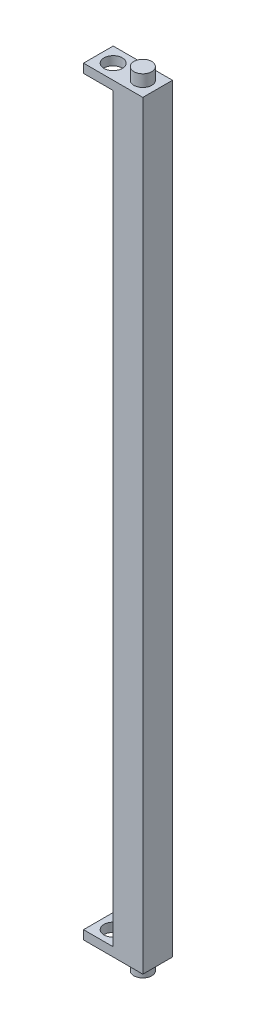
ISO-10303-21;
HEADER;
FILE_DESCRIPTION(('STEP AP214'),'2;1');
FILE_NAME('part.step','',(''),(''),'','','');
FILE_SCHEMA(('AUTOMOTIVE_DESIGN { 1 0 10303 214 1 1 1 1 }'));
ENDSEC;
DATA;
#1=APPLICATION_CONTEXT('core data for automotive mechanical design processes');
#2=APPLICATION_PROTOCOL_DEFINITION('international standard','automotive_design',2000,#1);
#3=PRODUCT_CONTEXT('',#1,'mechanical');
#4=PRODUCT('Part','Part','',(#3));
#5=PRODUCT_RELATED_PRODUCT_CATEGORY('part','',(#4));
#6=PRODUCT_DEFINITION_FORMATION('','',#4);
#7=PRODUCT_DEFINITION_CONTEXT('part definition',#1,'design');
#8=PRODUCT_DEFINITION('design','',#6,#7);
#9=PRODUCT_DEFINITION_SHAPE('','',#8);
#10=(LENGTH_UNIT() NAMED_UNIT(*) SI_UNIT(.MILLI.,.METRE.));
#11=(NAMED_UNIT(*) PLANE_ANGLE_UNIT() SI_UNIT($,.RADIAN.));
#12=(NAMED_UNIT(*) SI_UNIT($,.STERADIAN.) SOLID_ANGLE_UNIT());
#13=UNCERTAINTY_MEASURE_WITH_UNIT(LENGTH_MEASURE(1.E-05),#10,'distance_accuracy_value','');
#14=(GEOMETRIC_REPRESENTATION_CONTEXT(3) GLOBAL_UNCERTAINTY_ASSIGNED_CONTEXT((#13)) GLOBAL_UNIT_ASSIGNED_CONTEXT((#10,
#11,#12)) REPRESENTATION_CONTEXT('',''));
#15=CARTESIAN_POINT('',(0.,0.,0.));
#16=DIRECTION('',(0.,0.,1.));
#17=DIRECTION('',(1.,0.,0.));
#18=AXIS2_PLACEMENT_3D('',#15,#16,#17);
#19=CARTESIAN_POINT('',(0.,0.,0.));
#20=DIRECTION('',(0.,1.,0.));
#21=DIRECTION('',(0.,0.,1.));
#22=AXIS2_PLACEMENT_3D('',#19,#20,#21);
#23=PLANE('',#22);
#24=CARTESIAN_POINT('',(-2.5,0.,0.));
#25=DIRECTION('',(0.,-1.,0.));
#26=DIRECTION('',(0.,0.,-1.));
#27=AXIS2_PLACEMENT_3D('',#24,#25,#26);
#28=CIRCLE('',#27,1.55);
#29=CARTESIAN_POINT('',(-2.5,0.,-1.55));
#30=VERTEX_POINT('',#29);
#31=EDGE_CURVE('E156',#30,#30,#28,.T.);
#32=ORIENTED_EDGE('',*,*,#31,.F.);
#33=EDGE_LOOP('',(#32));
#34=FACE_BOUND('',#33,.T.);
#35=DIRECTION('',(0.,0.,-1.));
#36=VECTOR('',#35,1.);
#37=CARTESIAN_POINT('',(0.,0.,2.5));
#38=LINE('',#37,#36);
#39=CARTESIAN_POINT('',(0.,0.,2.5));
#40=VERTEX_POINT('',#39);
#41=CARTESIAN_POINT('',(0.,0.,-2.5));
#42=VERTEX_POINT('',#41);
#43=EDGE_CURVE('E49',#40,#42,#38,.T.);
#44=ORIENTED_EDGE('',*,*,#43,.F.);
#45=DIRECTION('',(-1.,0.,0.));
#46=VECTOR('',#45,1.);
#47=CARTESIAN_POINT('',(5.,0.,2.5));
#48=LINE('',#47,#46);
#49=CARTESIAN_POINT('',(-5.,0.,2.5));
#50=VERTEX_POINT('',#49);
#51=EDGE_CURVE('E71',#40,#50,#48,.T.);
#52=ORIENTED_EDGE('',*,*,#51,.T.);
#53=DIRECTION('',(0.,0.,-1.));
#54=VECTOR('',#53,1.);
#55=CARTESIAN_POINT('',(-5.,0.,2.5));
#56=LINE('',#55,#54);
#57=CARTESIAN_POINT('',(-5.,0.,-2.5));
#58=VERTEX_POINT('',#57);
#59=EDGE_CURVE('E170',#50,#58,#56,.T.);
#60=ORIENTED_EDGE('',*,*,#59,.T.);
#61=DIRECTION('',(-1.,0.,0.));
#62=VECTOR('',#61,1.);
#63=CARTESIAN_POINT('',(5.,0.,-2.5));
#64=LINE('',#63,#62);
#65=EDGE_CURVE('E160',#42,#58,#64,.T.);
#66=ORIENTED_EDGE('',*,*,#65,.F.);
#67=EDGE_LOOP('',(#44,#52,#60,#66));
#68=FACE_BOUND('',#67,.T.);
#69=ADVANCED_FACE('F34',(#34,#68),#23,.F.);
#70=CARTESIAN_POINT('',(5.,1.5,2.5));
#71=DIRECTION('',(-1.,0.,0.));
#72=DIRECTION('',(0.,0.,1.));
#73=AXIS2_PLACEMENT_3D('',#70,#71,#72);
#74=PLANE('',#73);
#75=DIRECTION('',(0.,-1.,0.));
#76=VECTOR('',#75,1.);
#77=CARTESIAN_POINT('',(5.,1.5,2.5));
#78=LINE('',#77,#76);
#79=CARTESIAN_POINT('',(5.,1.5,2.5));
#80=VERTEX_POINT('',#79);
#81=CARTESIAN_POINT('',(5.,-126.5,2.5));
#82=VERTEX_POINT('',#81);
#83=EDGE_CURVE('E58',#80,#82,#78,.T.);
#84=ORIENTED_EDGE('',*,*,#83,.T.);
#85=DIRECTION('',(0.,0.,1.));
#86=VECTOR('',#85,1.);
#87=CARTESIAN_POINT('',(5.,-126.5,2.5));
#88=LINE('',#87,#86);
#89=CARTESIAN_POINT('',(5.,-126.5,-2.5));
#90=VERTEX_POINT('',#89);
#91=EDGE_CURVE('E108',#90,#82,#88,.T.);
#92=ORIENTED_EDGE('',*,*,#91,.F.);
#93=DIRECTION('',(0.,-1.,0.));
#94=VECTOR('',#93,1.);
#95=CARTESIAN_POINT('',(5.,1.5,-2.5));
#96=LINE('',#95,#94);
#97=CARTESIAN_POINT('',(5.,1.5,-2.5));
#98=VERTEX_POINT('',#97);
#99=EDGE_CURVE('E42',#98,#90,#96,.T.);
#100=ORIENTED_EDGE('',*,*,#99,.F.);
#101=DIRECTION('',(0.,0.,-1.));
#102=VECTOR('',#101,1.);
#103=CARTESIAN_POINT('',(5.,1.5,2.5));
#104=LINE('',#103,#102);
#105=EDGE_CURVE('E109',#80,#98,#104,.T.);
#106=ORIENTED_EDGE('',*,*,#105,.F.);
#107=EDGE_LOOP('',(#84,#92,#100,#106));
#108=FACE_BOUND('',#107,.T.);
#109=ADVANCED_FACE('F36',(#108),#74,.F.);
#110=CARTESIAN_POINT('',(5.,1.5,-2.5));
#111=DIRECTION('',(0.,0.,1.));
#112=DIRECTION('',(1.,0.,0.));
#113=AXIS2_PLACEMENT_3D('',#110,#111,#112);
#114=PLANE('',#113);
#115=ORIENTED_EDGE('',*,*,#99,.T.);
#116=DIRECTION('',(1.,0.,0.));
#117=VECTOR('',#116,1.);
#118=CARTESIAN_POINT('',(5.,-126.5,-2.5));
#119=LINE('',#118,#117);
#120=CARTESIAN_POINT('',(-5.,-126.5,-2.5));
#121=VERTEX_POINT('',#120);
#122=EDGE_CURVE('E126',#121,#90,#119,.T.);
#123=ORIENTED_EDGE('',*,*,#122,.F.);
#124=DIRECTION('',(0.,1.,0.));
#125=VECTOR('',#124,1.);
#126=CARTESIAN_POINT('',(-5.,-126.5,-2.5));
#127=LINE('',#126,#125);
#128=CARTESIAN_POINT('',(-5.,-125.,-2.5));
#129=VERTEX_POINT('',#128);
#130=EDGE_CURVE('E138',#121,#129,#127,.T.);
#131=ORIENTED_EDGE('',*,*,#130,.T.);
#132=DIRECTION('',(1.,0.,0.));
#133=VECTOR('',#132,1.);
#134=CARTESIAN_POINT('',(5.,-125.,-2.5));
#135=LINE('',#134,#133);
#136=CARTESIAN_POINT('',(0.,-125.,-2.5));
#137=VERTEX_POINT('',#136);
#138=EDGE_CURVE('E127',#129,#137,#135,.T.);
#139=ORIENTED_EDGE('',*,*,#138,.T.);
#140=DIRECTION('',(0.,1.,0.));
#141=VECTOR('',#140,1.);
#142=CARTESIAN_POINT('',(0.,-125.,-2.5));
#143=LINE('',#142,#141);
#144=EDGE_CURVE('E149',#137,#42,#143,.T.);
#145=ORIENTED_EDGE('',*,*,#144,.T.);
#146=ORIENTED_EDGE('',*,*,#65,.T.);
#147=DIRECTION('',(0.,-1.,0.));
#148=VECTOR('',#147,1.);
#149=CARTESIAN_POINT('',(-5.,1.5,-2.5));
#150=LINE('',#149,#148);
#151=CARTESIAN_POINT('',(-5.,1.5,-2.5));
#152=VERTEX_POINT('',#151);
#153=EDGE_CURVE('E174',#152,#58,#150,.T.);
#154=ORIENTED_EDGE('',*,*,#153,.F.);
#155=DIRECTION('',(-1.,0.,0.));
#156=VECTOR('',#155,1.);
#157=CARTESIAN_POINT('',(5.,1.5,-2.5));
#158=LINE('',#157,#156);
#159=EDGE_CURVE('E79',#98,#152,#158,.T.);
#160=ORIENTED_EDGE('',*,*,#159,.F.);
#161=EDGE_LOOP('',(#115,#123,#131,#139,#145,#146,#154,#160));
#162=FACE_BOUND('',#161,.T.);
#163=ADVANCED_FACE('F176',(#162),#114,.F.);
#164=CARTESIAN_POINT('',(-5.,1.5,2.5));
#165=DIRECTION('',(-1.,0.,0.));
#166=DIRECTION('',(0.,0.,1.));
#167=AXIS2_PLACEMENT_3D('',#164,#165,#166);
#168=PLANE('',#167);
#169=ORIENTED_EDGE('',*,*,#59,.F.);
#170=DIRECTION('',(0.,-1.,0.));
#171=VECTOR('',#170,1.);
#172=CARTESIAN_POINT('',(-5.,1.5,2.5));
#173=LINE('',#172,#171);
#174=CARTESIAN_POINT('',(-5.,1.5,2.5));
#175=VERTEX_POINT('',#174);
#176=EDGE_CURVE('E111',#175,#50,#173,.T.);
#177=ORIENTED_EDGE('',*,*,#176,.F.);
#178=DIRECTION('',(0.,0.,-1.));
#179=VECTOR('',#178,1.);
#180=CARTESIAN_POINT('',(-5.,1.5,2.5));
#181=LINE('',#180,#179);
#182=EDGE_CURVE('E165',#175,#152,#181,.T.);
#183=ORIENTED_EDGE('',*,*,#182,.T.);
#184=ORIENTED_EDGE('',*,*,#153,.T.);
#185=EDGE_LOOP('',(#169,#177,#183,#184));
#186=FACE_BOUND('',#185,.T.);
#187=ADVANCED_FACE('F190',(#186),#168,.T.);
#188=CARTESIAN_POINT('',(5.,1.5,2.5));
#189=DIRECTION('',(0.,0.,1.));
#190=DIRECTION('',(1.,0.,0.));
#191=AXIS2_PLACEMENT_3D('',#188,#189,#190);
#192=PLANE('',#191);
#193=ORIENTED_EDGE('',*,*,#51,.F.);
#194=DIRECTION('',(0.,1.,0.));
#195=VECTOR('',#194,1.);
#196=CARTESIAN_POINT('',(0.,-125.,2.5));
#197=LINE('',#196,#195);
#198=CARTESIAN_POINT('',(0.,-125.,2.5));
#199=VERTEX_POINT('',#198);
#200=EDGE_CURVE('E153',#199,#40,#197,.T.);
#201=ORIENTED_EDGE('',*,*,#200,.F.);
#202=DIRECTION('',(-1.,0.,0.));
#203=VECTOR('',#202,1.);
#204=CARTESIAN_POINT('',(5.,-125.,2.5));
#205=LINE('',#204,#203);
#206=CARTESIAN_POINT('',(-5.,-125.,2.5));
#207=VERTEX_POINT('',#206);
#208=EDGE_CURVE('E139',#199,#207,#205,.T.);
#209=ORIENTED_EDGE('',*,*,#208,.T.);
#210=DIRECTION('',(0.,1.,0.));
#211=VECTOR('',#210,1.);
#212=CARTESIAN_POINT('',(-5.,-126.5,2.5));
#213=LINE('',#212,#211);
#214=CARTESIAN_POINT('',(-5.,-126.5,2.5));
#215=VERTEX_POINT('',#214);
#216=EDGE_CURVE('E118',#215,#207,#213,.T.);
#217=ORIENTED_EDGE('',*,*,#216,.F.);
#218=DIRECTION('',(-1.,0.,0.));
#219=VECTOR('',#218,1.);
#220=CARTESIAN_POINT('',(5.,-126.5,2.5));
#221=LINE('',#220,#219);
#222=EDGE_CURVE('E115',#82,#215,#221,.T.);
#223=ORIENTED_EDGE('',*,*,#222,.F.);
#224=ORIENTED_EDGE('',*,*,#83,.F.);
#225=DIRECTION('',(-1.,0.,0.));
#226=VECTOR('',#225,1.);
#227=CARTESIAN_POINT('',(5.,1.5,2.5));
#228=LINE('',#227,#226);
#229=EDGE_CURVE('E112',#80,#175,#228,.T.);
#230=ORIENTED_EDGE('',*,*,#229,.T.);
#231=ORIENTED_EDGE('',*,*,#176,.T.);
#232=EDGE_LOOP('',(#193,#201,#209,#217,#223,#224,#230,#231));
#233=FACE_BOUND('',#232,.T.);
#234=ADVANCED_FACE('F116',(#233),#192,.T.);
#235=CARTESIAN_POINT('',(0.,1.5,0.));
#236=DIRECTION('',(0.,1.,0.));
#237=DIRECTION('',(0.,0.,1.));
#238=AXIS2_PLACEMENT_3D('',#235,#236,#237);
#239=PLANE('',#238);
#240=CARTESIAN_POINT('',(2.5,1.5,0.));
#241=DIRECTION('',(0.,1.,0.));
#242=DIRECTION('',(0.,0.,1.));
#243=AXIS2_PLACEMENT_3D('',#240,#241,#242);
#244=CIRCLE('',#243,1.5);
#245=CARTESIAN_POINT('',(2.5,1.5,1.5));
#246=VERTEX_POINT('',#245);
#247=EDGE_CURVE('E329',#246,#246,#244,.T.);
#248=ORIENTED_EDGE('',*,*,#247,.F.);
#249=EDGE_LOOP('',(#248));
#250=FACE_BOUND('',#249,.T.);
#251=CARTESIAN_POINT('',(-2.5,1.5,0.));
#252=DIRECTION('',(0.,-1.,0.));
#253=DIRECTION('',(0.,0.,-1.));
#254=AXIS2_PLACEMENT_3D('',#251,#252,#253);
#255=CIRCLE('',#254,1.55);
#256=CARTESIAN_POINT('',(-2.5,1.5,-1.55));
#257=VERTEX_POINT('',#256);
#258=EDGE_CURVE('E157',#257,#257,#255,.T.);
#259=ORIENTED_EDGE('',*,*,#258,.T.);
#260=EDGE_LOOP('',(#259));
#261=FACE_BOUND('',#260,.T.);
#262=ORIENTED_EDGE('',*,*,#105,.T.);
#263=ORIENTED_EDGE('',*,*,#159,.T.);
#264=ORIENTED_EDGE('',*,*,#182,.F.);
#265=ORIENTED_EDGE('',*,*,#229,.F.);
#266=EDGE_LOOP('',(#262,#263,#264,#265));
#267=FACE_BOUND('',#266,.T.);
#268=ADVANCED_FACE('F192',(#250,#261,#267),#239,.T.);
#269=CARTESIAN_POINT('',(-2.5,1.5,0.));
#270=DIRECTION('',(0.,-1.,0.));
#271=DIRECTION('',(0.,0.,-1.));
#272=AXIS2_PLACEMENT_3D('',#269,#270,#271);
#273=CYLINDRICAL_SURFACE('',#272,1.55);
#274=ORIENTED_EDGE('',*,*,#258,.F.);
#275=EDGE_LOOP('',(#274));
#276=FACE_BOUND('',#275,.T.);
#277=ORIENTED_EDGE('',*,*,#31,.T.);
#278=EDGE_LOOP('',(#277));
#279=FACE_BOUND('',#278,.T.);
#280=ADVANCED_FACE('F194',(#276,#279),#273,.F.);
#281=CARTESIAN_POINT('',(0.,-125.,2.5));
#282=DIRECTION('',(1.,0.,0.));
#283=DIRECTION('',(0.,0.,-1.));
#284=AXIS2_PLACEMENT_3D('',#281,#282,#283);
#285=PLANE('',#284);
#286=ORIENTED_EDGE('',*,*,#43,.T.);
#287=ORIENTED_EDGE('',*,*,#144,.F.);
#288=DIRECTION('',(0.,0.,-1.));
#289=VECTOR('',#288,1.);
#290=CARTESIAN_POINT('',(0.,-125.,2.5));
#291=LINE('',#290,#289);
#292=EDGE_CURVE('E146',#199,#137,#291,.T.);
#293=ORIENTED_EDGE('',*,*,#292,.F.);
#294=ORIENTED_EDGE('',*,*,#200,.T.);
#295=EDGE_LOOP('',(#286,#287,#293,#294));
#296=FACE_BOUND('',#295,.T.);
#297=ADVANCED_FACE('F186',(#296),#285,.F.);
#298=CARTESIAN_POINT('',(-5.,-126.5,2.5));
#299=DIRECTION('',(1.,0.,0.));
#300=DIRECTION('',(0.,0.,-1.));
#301=AXIS2_PLACEMENT_3D('',#298,#299,#300);
#302=PLANE('',#301);
#303=DIRECTION('',(0.,0.,-1.));
#304=VECTOR('',#303,1.);
#305=CARTESIAN_POINT('',(-5.,-125.,2.5));
#306=LINE('',#305,#304);
#307=EDGE_CURVE('E130',#207,#129,#306,.T.);
#308=ORIENTED_EDGE('',*,*,#307,.T.);
#309=ORIENTED_EDGE('',*,*,#130,.F.);
#310=DIRECTION('',(0.,0.,-1.));
#311=VECTOR('',#310,1.);
#312=CARTESIAN_POINT('',(-5.,-126.5,2.5));
#313=LINE('',#312,#311);
#314=EDGE_CURVE('E121',#215,#121,#313,.T.);
#315=ORIENTED_EDGE('',*,*,#314,.F.);
#316=ORIENTED_EDGE('',*,*,#216,.T.);
#317=EDGE_LOOP('',(#308,#309,#315,#316));
#318=FACE_BOUND('',#317,.T.);
#319=ADVANCED_FACE('F240',(#318),#302,.F.);
#320=CARTESIAN_POINT('',(0.,-126.5,0.));
#321=DIRECTION('',(0.,1.,0.));
#322=DIRECTION('',(0.,0.,1.));
#323=AXIS2_PLACEMENT_3D('',#320,#321,#322);
#324=PLANE('',#323);
#325=CARTESIAN_POINT('',(2.5,-126.5,0.));
#326=DIRECTION('',(0.,1.,0.));
#327=DIRECTION('',(0.,0.,1.));
#328=AXIS2_PLACEMENT_3D('',#325,#326,#327);
#329=CIRCLE('',#328,1.5);
#330=CARTESIAN_POINT('',(2.5,-126.5,1.5));
#331=VERTEX_POINT('',#330);
#332=EDGE_CURVE('E11',#331,#331,#329,.F.);
#333=ORIENTED_EDGE('',*,*,#332,.F.);
#334=EDGE_LOOP('',(#333));
#335=FACE_BOUND('',#334,.T.);
#336=CARTESIAN_POINT('',(-2.5,-126.5,0.));
#337=DIRECTION('',(0.,-1.,0.));
#338=DIRECTION('',(0.,0.,-1.));
#339=AXIS2_PLACEMENT_3D('',#336,#337,#338);
#340=CIRCLE('',#339,1.55);
#341=CARTESIAN_POINT('',(-2.5,-126.5,-1.55));
#342=VERTEX_POINT('',#341);
#343=EDGE_CURVE('E133',#342,#342,#340,.T.);
#344=ORIENTED_EDGE('',*,*,#343,.F.);
#345=EDGE_LOOP('',(#344));
#346=FACE_BOUND('',#345,.T.);
#347=ORIENTED_EDGE('',*,*,#91,.T.);
#348=ORIENTED_EDGE('',*,*,#222,.T.);
#349=ORIENTED_EDGE('',*,*,#314,.T.);
#350=ORIENTED_EDGE('',*,*,#122,.T.);
#351=EDGE_LOOP('',(#347,#348,#349,#350));
#352=FACE_BOUND('',#351,.T.);
#353=ADVANCED_FACE('F124',(#335,#346,#352),#324,.F.);
#354=CARTESIAN_POINT('',(0.,-125.,0.));
#355=DIRECTION('',(0.,1.,0.));
#356=DIRECTION('',(0.,0.,1.));
#357=AXIS2_PLACEMENT_3D('',#354,#355,#356);
#358=PLANE('',#357);
#359=CARTESIAN_POINT('',(-2.5,-125.,0.));
#360=DIRECTION('',(0.,-1.,0.));
#361=DIRECTION('',(0.,0.,-1.));
#362=AXIS2_PLACEMENT_3D('',#359,#360,#361);
#363=CIRCLE('',#362,1.55);
#364=CARTESIAN_POINT('',(-2.5,-125.,-1.55));
#365=VERTEX_POINT('',#364);
#366=EDGE_CURVE('E141',#365,#365,#363,.T.);
#367=ORIENTED_EDGE('',*,*,#366,.T.);
#368=EDGE_LOOP('',(#367));
#369=FACE_BOUND('',#368,.T.);
#370=ORIENTED_EDGE('',*,*,#208,.F.);
#371=ORIENTED_EDGE('',*,*,#292,.T.);
#372=ORIENTED_EDGE('',*,*,#138,.F.);
#373=ORIENTED_EDGE('',*,*,#307,.F.);
#374=EDGE_LOOP('',(#370,#371,#372,#373));
#375=FACE_BOUND('',#374,.T.);
#376=ADVANCED_FACE('F183',(#369,#375),#358,.T.);
#377=CARTESIAN_POINT('',(-2.5,-125.,0.));
#378=DIRECTION('',(0.,-1.,0.));
#379=DIRECTION('',(0.,0.,-1.));
#380=AXIS2_PLACEMENT_3D('',#377,#378,#379);
#381=CYLINDRICAL_SURFACE('',#380,1.55);
#382=ORIENTED_EDGE('',*,*,#366,.F.);
#383=EDGE_LOOP('',(#382));
#384=FACE_BOUND('',#383,.T.);
#385=ORIENTED_EDGE('',*,*,#343,.T.);
#386=EDGE_LOOP('',(#385));
#387=FACE_BOUND('',#386,.T.);
#388=ADVANCED_FACE('F259',(#384,#387),#381,.F.);
#389=CARTESIAN_POINT('',(2.5,3.5,0.));
#390=DIRECTION('',(0.,-1.,0.));
#391=DIRECTION('',(0.,0.,-1.));
#392=AXIS2_PLACEMENT_3D('',#389,#390,#391);
#393=CYLINDRICAL_SURFACE('',#392,1.5);
#394=CARTESIAN_POINT('',(2.5,3.5,0.));
#395=DIRECTION('',(0.,1.,0.));
#396=DIRECTION('',(0.,0.,1.));
#397=AXIS2_PLACEMENT_3D('',#394,#395,#396);
#398=CIRCLE('',#397,1.5);
#399=CARTESIAN_POINT('',(2.5,3.5,1.5));
#400=VERTEX_POINT('',#399);
#401=EDGE_CURVE('E332',#400,#400,#398,.T.);
#402=ORIENTED_EDGE('',*,*,#401,.F.);
#403=EDGE_LOOP('',(#402));
#404=FACE_BOUND('',#403,.T.);
#405=ORIENTED_EDGE('',*,*,#247,.T.);
#406=EDGE_LOOP('',(#405));
#407=FACE_BOUND('',#406,.T.);
#408=ADVANCED_FACE('F268',(#404,#407),#393,.T.);
#409=CARTESIAN_POINT('',(2.5,3.5,0.));
#410=DIRECTION('',(0.,1.,0.));
#411=DIRECTION('',(0.,0.,1.));
#412=AXIS2_PLACEMENT_3D('',#409,#410,#411);
#413=PLANE('',#412);
#414=ORIENTED_EDGE('',*,*,#401,.T.);
#415=EDGE_LOOP('',(#414));
#416=FACE_BOUND('',#415,.T.);
#417=ADVANCED_FACE('F285',(#416),#413,.T.);
#418=CARTESIAN_POINT('',(2.5,-128.5,0.));
#419=DIRECTION('',(0.,1.,0.));
#420=DIRECTION('',(0.,0.,1.));
#421=AXIS2_PLACEMENT_3D('',#418,#419,#420);
#422=CYLINDRICAL_SURFACE('',#421,1.5);
#423=CARTESIAN_POINT('',(2.5,-128.5,0.));
#424=DIRECTION('',(0.,-1.,0.));
#425=DIRECTION('',(0.,0.,-1.));
#426=AXIS2_PLACEMENT_3D('',#423,#424,#425);
#427=CIRCLE('',#426,1.5);
#428=CARTESIAN_POINT('',(2.5,-128.5,-1.5));
#429=VERTEX_POINT('',#428);
#430=EDGE_CURVE('E328',#429,#429,#427,.T.);
#431=ORIENTED_EDGE('',*,*,#430,.F.);
#432=EDGE_LOOP('',(#431));
#433=FACE_BOUND('',#432,.T.);
#434=ORIENTED_EDGE('',*,*,#332,.T.);
#435=EDGE_LOOP('',(#434));
#436=FACE_BOUND('',#435,.T.);
#437=ADVANCED_FACE('F295',(#433,#436),#422,.T.);
#438=CARTESIAN_POINT('',(2.5,-128.5,0.));
#439=DIRECTION('',(0.,-1.,0.));
#440=DIRECTION('',(0.,0.,-1.));
#441=AXIS2_PLACEMENT_3D('',#438,#439,#440);
#442=PLANE('',#441);
#443=ORIENTED_EDGE('',*,*,#430,.T.);
#444=EDGE_LOOP('',(#443));
#445=FACE_BOUND('',#444,.T.);
#446=ADVANCED_FACE('F312',(#445),#442,.T.);
#447=CLOSED_SHELL('',(#69,#109,#163,#187,#234,#268,#280,#297,#319,#353,#376,#388,#408,#417,#437,#446));
#448=MANIFOLD_SOLID_BREP('B2',#447);
#449=ADVANCED_BREP_SHAPE_REPRESENTATION('',(#18,#448),#14);
#450=SHAPE_DEFINITION_REPRESENTATION(#9,#449);
ENDSEC;
END-ISO-10303-21;
